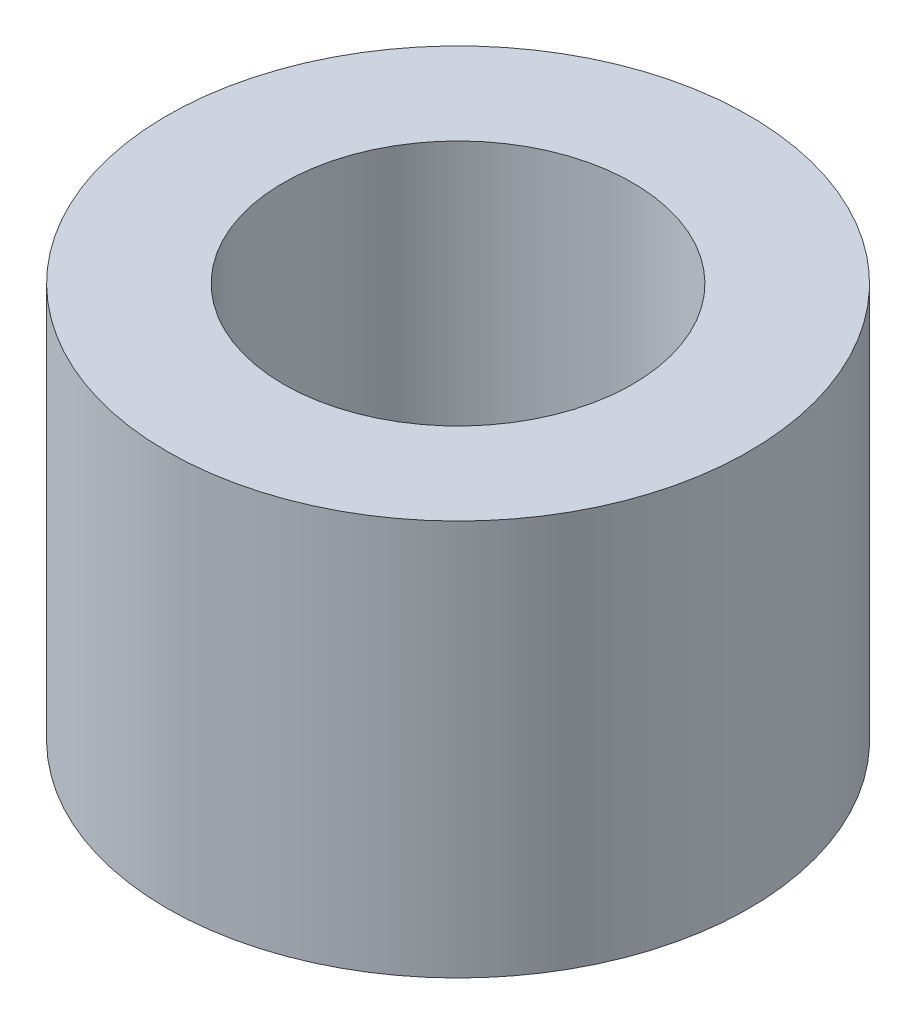
ISO-10303-21;
HEADER;
FILE_DESCRIPTION(('STEP AP214'),'2;1');
FILE_NAME('part.step','',(''),(''),'','','');
FILE_SCHEMA(('AUTOMOTIVE_DESIGN { 1 0 10303 214 1 1 1 1 }'));
ENDSEC;
DATA;
#1=APPLICATION_CONTEXT('core data for automotive mechanical design processes');
#2=APPLICATION_PROTOCOL_DEFINITION('international standard','automotive_design',2000,#1);
#3=PRODUCT_CONTEXT('',#1,'mechanical');
#4=PRODUCT('Part','Part','',(#3));
#5=PRODUCT_RELATED_PRODUCT_CATEGORY('part','',(#4));
#6=PRODUCT_DEFINITION_FORMATION('','',#4);
#7=PRODUCT_DEFINITION_CONTEXT('part definition',#1,'design');
#8=PRODUCT_DEFINITION('design','',#6,#7);
#9=PRODUCT_DEFINITION_SHAPE('','',#8);
#10=(LENGTH_UNIT() NAMED_UNIT(*) SI_UNIT(.MILLI.,.METRE.));
#11=(NAMED_UNIT(*) PLANE_ANGLE_UNIT() SI_UNIT($,.RADIAN.));
#12=(NAMED_UNIT(*) SI_UNIT($,.STERADIAN.) SOLID_ANGLE_UNIT());
#13=UNCERTAINTY_MEASURE_WITH_UNIT(LENGTH_MEASURE(1.E-05),#10,'distance_accuracy_value','');
#14=(GEOMETRIC_REPRESENTATION_CONTEXT(3) GLOBAL_UNCERTAINTY_ASSIGNED_CONTEXT((#13)) GLOBAL_UNIT_ASSIGNED_CONTEXT((#10,
#11,#12)) REPRESENTATION_CONTEXT('',''));
#15=CARTESIAN_POINT('',(0.,0.,0.));
#16=DIRECTION('',(0.,0.,1.));
#17=DIRECTION('',(1.,0.,0.));
#18=AXIS2_PLACEMENT_3D('',#15,#16,#17);
#19=CARTESIAN_POINT('',(0.,3.4,0.));
#20=DIRECTION('',(0.,1.,0.));
#21=DIRECTION('',(0.,0.,1.));
#22=AXIS2_PLACEMENT_3D('',#19,#20,#21);
#23=PLANE('',#22);
#24=CARTESIAN_POINT('',(0.,3.4,0.));
#25=DIRECTION('',(0.,1.,0.));
#26=DIRECTION('',(0.,0.,1.));
#27=AXIS2_PLACEMENT_3D('',#24,#25,#26);
#28=CIRCLE('',#27,2.5);
#29=CARTESIAN_POINT('',(0.,3.4,2.5));
#30=VERTEX_POINT('',#29);
#31=EDGE_CURVE('E10',#30,#30,#28,.T.);
#32=ORIENTED_EDGE('',*,*,#31,.T.);
#33=EDGE_LOOP('',(#32));
#34=FACE_BOUND('',#33,.T.);
#35=CARTESIAN_POINT('',(0.,3.4,0.));
#36=DIRECTION('',(0.,1.,0.));
#37=DIRECTION('',(0.,0.,1.));
#38=AXIS2_PLACEMENT_3D('',#35,#36,#37);
#39=CIRCLE('',#38,1.5);
#40=CARTESIAN_POINT('',(0.,3.4,1.5));
#41=VERTEX_POINT('',#40);
#42=EDGE_CURVE('E54',#41,#41,#39,.T.);
#43=ORIENTED_EDGE('',*,*,#42,.F.);
#44=EDGE_LOOP('',(#43));
#45=FACE_BOUND('',#44,.T.);
#46=ADVANCED_FACE('F41',(#34,#45),#23,.T.);
#47=CARTESIAN_POINT('',(0.,0.,0.));
#48=DIRECTION('',(0.,1.,0.));
#49=DIRECTION('',(0.,0.,1.));
#50=AXIS2_PLACEMENT_3D('',#47,#48,#49);
#51=PLANE('',#50);
#52=CARTESIAN_POINT('',(0.,0.,0.));
#53=DIRECTION('',(0.,1.,0.));
#54=DIRECTION('',(0.,0.,1.));
#55=AXIS2_PLACEMENT_3D('',#52,#53,#54);
#56=CIRCLE('',#55,2.5);
#57=CARTESIAN_POINT('',(0.,0.,2.5));
#58=VERTEX_POINT('',#57);
#59=EDGE_CURVE('E45',#58,#58,#56,.T.);
#60=ORIENTED_EDGE('',*,*,#59,.F.);
#61=EDGE_LOOP('',(#60));
#62=FACE_BOUND('',#61,.T.);
#63=CARTESIAN_POINT('',(0.,0.,0.));
#64=DIRECTION('',(0.,1.,0.));
#65=DIRECTION('',(0.,0.,1.));
#66=AXIS2_PLACEMENT_3D('',#63,#64,#65);
#67=CIRCLE('',#66,1.5);
#68=CARTESIAN_POINT('',(0.,0.,1.5));
#69=VERTEX_POINT('',#68);
#70=EDGE_CURVE('E56',#69,#69,#67,.T.);
#71=ORIENTED_EDGE('',*,*,#70,.T.);
#72=EDGE_LOOP('',(#71));
#73=FACE_BOUND('',#72,.T.);
#74=ADVANCED_FACE('F68',(#62,#73),#51,.F.);
#75=CARTESIAN_POINT('',(0.,3.4,0.));
#76=DIRECTION('',(0.,-1.,0.));
#77=DIRECTION('',(0.,0.,-1.));
#78=AXIS2_PLACEMENT_3D('',#75,#76,#77);
#79=CYLINDRICAL_SURFACE('',#78,2.5);
#80=ORIENTED_EDGE('',*,*,#31,.F.);
#81=EDGE_LOOP('',(#80));
#82=FACE_BOUND('',#81,.T.);
#83=ORIENTED_EDGE('',*,*,#59,.T.);
#84=EDGE_LOOP('',(#83));
#85=FACE_BOUND('',#84,.T.);
#86=ADVANCED_FACE('F43',(#82,#85),#79,.T.);
#87=CARTESIAN_POINT('',(0.,3.4,0.));
#88=DIRECTION('',(0.,-1.,0.));
#89=DIRECTION('',(0.,0.,-1.));
#90=AXIS2_PLACEMENT_3D('',#87,#88,#89);
#91=CYLINDRICAL_SURFACE('',#90,1.5);
#92=ORIENTED_EDGE('',*,*,#42,.T.);
#93=EDGE_LOOP('',(#92));
#94=FACE_BOUND('',#93,.T.);
#95=ORIENTED_EDGE('',*,*,#70,.F.);
#96=EDGE_LOOP('',(#95));
#97=FACE_BOUND('',#96,.T.);
#98=ADVANCED_FACE('F64',(#94,#97),#91,.F.);
#99=CLOSED_SHELL('',(#46,#74,#86,#98));
#100=MANIFOLD_SOLID_BREP('B2',#99);
#101=ADVANCED_BREP_SHAPE_REPRESENTATION('',(#18,#100),#14);
#102=SHAPE_DEFINITION_REPRESENTATION(#9,#101);
ENDSEC;
END-ISO-10303-21;
